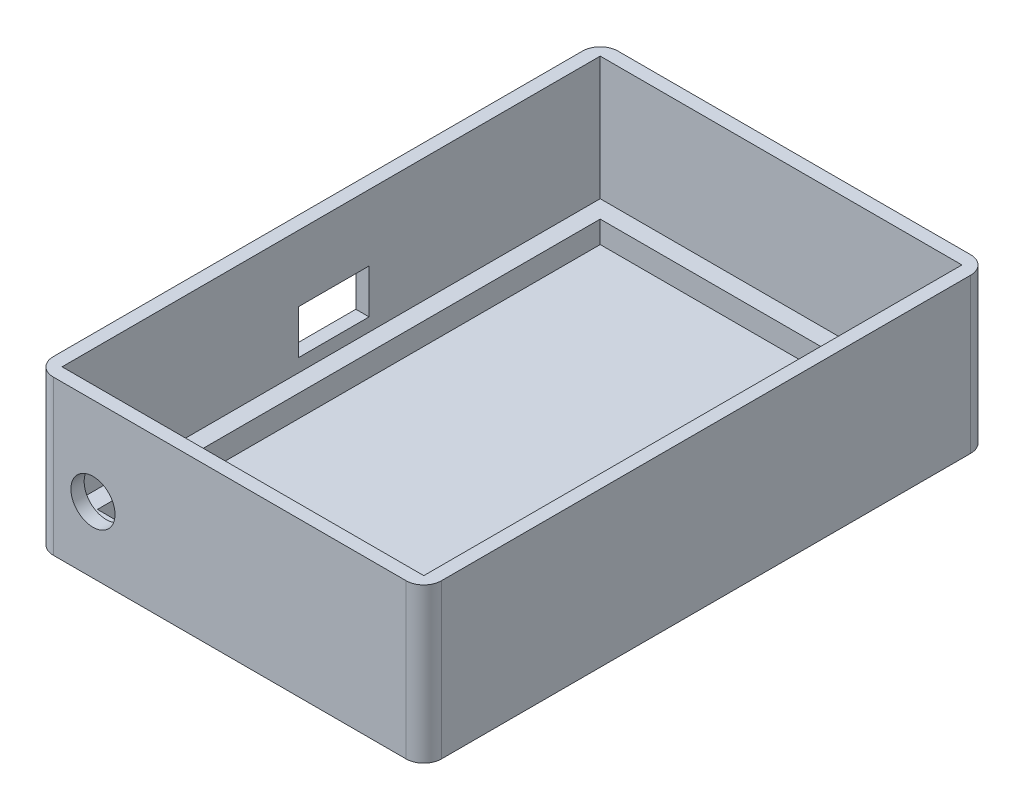
ISO-10303-21;
HEADER;
FILE_DESCRIPTION(('STEP AP214'),'2;1');
FILE_NAME('part.step','',(''),(''),'','','');
FILE_SCHEMA(('AUTOMOTIVE_DESIGN { 1 0 10303 214 1 1 1 1 }'));
ENDSEC;
DATA;
#1=APPLICATION_CONTEXT('core data for automotive mechanical design processes');
#2=APPLICATION_PROTOCOL_DEFINITION('international standard','automotive_design',2000,#1);
#3=PRODUCT_CONTEXT('',#1,'mechanical');
#4=PRODUCT('Part','Part','',(#3));
#5=PRODUCT_RELATED_PRODUCT_CATEGORY('part','',(#4));
#6=PRODUCT_DEFINITION_FORMATION('','',#4);
#7=PRODUCT_DEFINITION_CONTEXT('part definition',#1,'design');
#8=PRODUCT_DEFINITION('design','',#6,#7);
#9=PRODUCT_DEFINITION_SHAPE('','',#8);
#10=(LENGTH_UNIT() NAMED_UNIT(*) SI_UNIT(.MILLI.,.METRE.));
#11=(NAMED_UNIT(*) PLANE_ANGLE_UNIT() SI_UNIT($,.RADIAN.));
#12=(NAMED_UNIT(*) SI_UNIT($,.STERADIAN.) SOLID_ANGLE_UNIT());
#13=UNCERTAINTY_MEASURE_WITH_UNIT(LENGTH_MEASURE(1.E-05),#10,'distance_accuracy_value','');
#14=(GEOMETRIC_REPRESENTATION_CONTEXT(3) GLOBAL_UNCERTAINTY_ASSIGNED_CONTEXT((#13)) GLOBAL_UNIT_ASSIGNED_CONTEXT((#10,
#11,#12)) REPRESENTATION_CONTEXT('',''));
#15=CARTESIAN_POINT('',(0.,0.,0.));
#16=DIRECTION('',(0.,0.,1.));
#17=DIRECTION('',(1.,0.,0.));
#18=AXIS2_PLACEMENT_3D('',#15,#16,#17);
#19=CARTESIAN_POINT('',(-22.,-2.5,0.));
#20=DIRECTION('',(1.,0.,0.));
#21=DIRECTION('',(0.,0.,-1.));
#22=AXIS2_PLACEMENT_3D('',#19,#20,#21);
#23=PLANE('',#22);
#24=DIRECTION('',(0.,0.,-1.));
#25=VECTOR('',#24,1.);
#26=CARTESIAN_POINT('',(-22.,1.5,0.));
#27=LINE('',#26,#25);
#28=CARTESIAN_POINT('',(-22.,1.5,3.70191610471693));
#29=VERTEX_POINT('',#28);
#30=CARTESIAN_POINT('',(-22.,1.5,-4.29808389528307));
#31=VERTEX_POINT('',#30);
#32=EDGE_CURVE('E209',#29,#31,#27,.T.);
#33=ORIENTED_EDGE('',*,*,#32,.T.);
#34=DIRECTION('',(0.,1.,0.));
#35=VECTOR('',#34,1.);
#36=CARTESIAN_POINT('',(-22.,-2.5,-4.29808389528307));
#37=LINE('',#36,#35);
#38=CARTESIAN_POINT('',(-22.,6.5,-4.29808389528307));
#39=VERTEX_POINT('',#38);
#40=EDGE_CURVE('E212',#31,#39,#37,.T.);
#41=ORIENTED_EDGE('',*,*,#40,.T.);
#42=DIRECTION('',(0.,0.,1.));
#43=VECTOR('',#42,1.);
#44=CARTESIAN_POINT('',(-22.,6.5,0.));
#45=LINE('',#44,#43);
#46=CARTESIAN_POINT('',(-22.,6.5,3.70191610471693));
#47=VERTEX_POINT('',#46);
#48=EDGE_CURVE('E204',#39,#47,#45,.T.);
#49=ORIENTED_EDGE('',*,*,#48,.T.);
#50=DIRECTION('',(0.,-1.,0.));
#51=VECTOR('',#50,1.);
#52=CARTESIAN_POINT('',(-22.,-2.5,3.70191610471693));
#53=LINE('',#52,#51);
#54=EDGE_CURVE('E179',#47,#29,#53,.T.);
#55=ORIENTED_EDGE('',*,*,#54,.T.);
#56=EDGE_LOOP('',(#33,#41,#49,#55));
#57=FACE_BOUND('',#56,.T.);
#58=DIRECTION('',(0.,0.,-1.));
#59=VECTOR('',#58,1.);
#60=CARTESIAN_POINT('',(-22.,-3.5,32.));
#61=LINE('',#60,#59);
#62=CARTESIAN_POINT('',(-22.,-3.5,30.));
#63=VERTEX_POINT('',#62);
#64=CARTESIAN_POINT('',(-22.,-3.5,-30.));
#65=VERTEX_POINT('',#64);
#66=EDGE_CURVE('E218',#63,#65,#61,.T.);
#67=ORIENTED_EDGE('',*,*,#66,.F.);
#68=DIRECTION('',(0.,1.,0.));
#69=VECTOR('',#68,1.);
#70=CARTESIAN_POINT('',(-22.,14.,30.));
#71=LINE('',#70,#69);
#72=CARTESIAN_POINT('',(-22.,14.,30.));
#73=VERTEX_POINT('',#72);
#74=EDGE_CURVE('E299',#63,#73,#71,.T.);
#75=ORIENTED_EDGE('',*,*,#74,.T.);
#76=DIRECTION('',(0.,0.,1.));
#77=VECTOR('',#76,1.);
#78=CARTESIAN_POINT('',(-22.,14.,32.));
#79=LINE('',#78,#77);
#80=CARTESIAN_POINT('',(-22.,14.,-30.));
#81=VERTEX_POINT('',#80);
#82=EDGE_CURVE('E263',#81,#73,#79,.T.);
#83=ORIENTED_EDGE('',*,*,#82,.F.);
#84=DIRECTION('',(0.,1.,0.));
#85=VECTOR('',#84,1.);
#86=CARTESIAN_POINT('',(-22.,-2.5,-30.));
#87=LINE('',#86,#85);
#88=EDGE_CURVE('E292',#81,#65,#87,.F.);
#89=ORIENTED_EDGE('',*,*,#88,.T.);
#90=EDGE_LOOP('',(#67,#75,#83,#89));
#91=FACE_BOUND('',#90,.T.);
#92=ADVANCED_FACE('F33',(#57,#91),#23,.F.);
#93=CARTESIAN_POINT('',(0.,-2.5,-32.));
#94=DIRECTION('',(0.,0.,1.));
#95=DIRECTION('',(1.,0.,0.));
#96=AXIS2_PLACEMENT_3D('',#93,#94,#95);
#97=PLANE('',#96);
#98=DIRECTION('',(-1.,0.,0.));
#99=VECTOR('',#98,1.);
#100=CARTESIAN_POINT('',(-22.,14.,-32.));
#101=LINE('',#100,#99);
#102=CARTESIAN_POINT('',(20.,14.,-32.));
#103=VERTEX_POINT('',#102);
#104=CARTESIAN_POINT('',(-20.,14.,-32.));
#105=VERTEX_POINT('',#104);
#106=EDGE_CURVE('E260',#103,#105,#101,.T.);
#107=ORIENTED_EDGE('',*,*,#106,.F.);
#108=DIRECTION('',(0.,1.,0.));
#109=VECTOR('',#108,1.);
#110=CARTESIAN_POINT('',(20.,-3.5,-32.));
#111=LINE('',#110,#109);
#112=CARTESIAN_POINT('',(20.,-3.5,-32.));
#113=VERTEX_POINT('',#112);
#114=EDGE_CURVE('E11',#103,#113,#111,.F.);
#115=ORIENTED_EDGE('',*,*,#114,.T.);
#116=DIRECTION('',(1.,0.,0.));
#117=VECTOR('',#116,1.);
#118=CARTESIAN_POINT('',(-22.,-3.5,-32.));
#119=LINE('',#118,#117);
#120=CARTESIAN_POINT('',(-20.,-3.5,-32.));
#121=VERTEX_POINT('',#120);
#122=EDGE_CURVE('E221',#121,#113,#119,.T.);
#123=ORIENTED_EDGE('',*,*,#122,.F.);
#124=DIRECTION('',(0.,1.,0.));
#125=VECTOR('',#124,1.);
#126=CARTESIAN_POINT('',(-20.,-2.5,-32.));
#127=LINE('',#126,#125);
#128=EDGE_CURVE('E41',#121,#105,#127,.T.);
#129=ORIENTED_EDGE('',*,*,#128,.T.);
#130=EDGE_LOOP('',(#107,#115,#123,#129));
#131=FACE_BOUND('',#130,.T.);
#132=ADVANCED_FACE('F330',(#131),#97,.F.);
#133=CARTESIAN_POINT('',(22.,-2.5,0.));
#134=DIRECTION('',(1.,0.,0.));
#135=DIRECTION('',(0.,0.,-1.));
#136=AXIS2_PLACEMENT_3D('',#133,#134,#135);
#137=PLANE('',#136);
#138=DIRECTION('',(0.,0.,-1.));
#139=VECTOR('',#138,1.);
#140=CARTESIAN_POINT('',(22.,14.,32.));
#141=LINE('',#140,#139);
#142=CARTESIAN_POINT('',(22.,14.,30.));
#143=VERTEX_POINT('',#142);
#144=CARTESIAN_POINT('',(22.,14.,-30.));
#145=VERTEX_POINT('',#144);
#146=EDGE_CURVE('E257',#143,#145,#141,.T.);
#147=ORIENTED_EDGE('',*,*,#146,.F.);
#148=DIRECTION('',(0.,1.,0.));
#149=VECTOR('',#148,1.);
#150=CARTESIAN_POINT('',(22.,-2.5,30.));
#151=LINE('',#150,#149);
#152=CARTESIAN_POINT('',(22.,-3.5,30.));
#153=VERTEX_POINT('',#152);
#154=EDGE_CURVE('E48',#143,#153,#151,.F.);
#155=ORIENTED_EDGE('',*,*,#154,.T.);
#156=DIRECTION('',(0.,0.,1.));
#157=VECTOR('',#156,1.);
#158=CARTESIAN_POINT('',(22.,-3.5,-32.));
#159=LINE('',#158,#157);
#160=CARTESIAN_POINT('',(22.,-3.5,-30.));
#161=VERTEX_POINT('',#160);
#162=EDGE_CURVE('E223',#161,#153,#159,.T.);
#163=ORIENTED_EDGE('',*,*,#162,.F.);
#164=DIRECTION('',(0.,1.,0.));
#165=VECTOR('',#164,1.);
#166=CARTESIAN_POINT('',(22.,14.,-30.));
#167=LINE('',#166,#165);
#168=EDGE_CURVE('E322',#161,#145,#167,.T.);
#169=ORIENTED_EDGE('',*,*,#168,.T.);
#170=EDGE_LOOP('',(#147,#155,#163,#169));
#171=FACE_BOUND('',#170,.T.);
#172=ADVANCED_FACE('F341',(#171),#137,.T.);
#173=CARTESIAN_POINT('',(0.,-2.5,28.5));
#174=DIRECTION('',(0.,0.,1.));
#175=DIRECTION('',(1.,0.,0.));
#176=AXIS2_PLACEMENT_3D('',#173,#174,#175);
#177=PLANE('',#176);
#178=DIRECTION('',(1.,0.,0.));
#179=VECTOR('',#178,1.);
#180=CARTESIAN_POINT('',(0.,0.,28.5));
#181=LINE('',#180,#179);
#182=CARTESIAN_POINT('',(-18.5,0.,28.5));
#183=VERTEX_POINT('',#182);
#184=CARTESIAN_POINT('',(18.5,0.,28.5));
#185=VERTEX_POINT('',#184);
#186=EDGE_CURVE('E266',#183,#185,#181,.T.);
#187=ORIENTED_EDGE('',*,*,#186,.T.);
#188=DIRECTION('',(0.,1.,0.));
#189=VECTOR('',#188,1.);
#190=CARTESIAN_POINT('',(18.5,-2.5,28.5));
#191=LINE('',#190,#189);
#192=CARTESIAN_POINT('',(18.5,-2.5,28.5));
#193=VERTEX_POINT('',#192);
#194=EDGE_CURVE('E289',#193,#185,#191,.T.);
#195=ORIENTED_EDGE('',*,*,#194,.F.);
#196=DIRECTION('',(1.,0.,0.));
#197=VECTOR('',#196,1.);
#198=CARTESIAN_POINT('',(0.,-2.5,28.5));
#199=LINE('',#198,#197);
#200=CARTESIAN_POINT('',(-18.5,-2.5,28.5));
#201=VERTEX_POINT('',#200);
#202=EDGE_CURVE('E267',#201,#193,#199,.T.);
#203=ORIENTED_EDGE('',*,*,#202,.F.);
#204=DIRECTION('',(0.,1.,0.));
#205=VECTOR('',#204,1.);
#206=CARTESIAN_POINT('',(-18.5,-2.5,28.5));
#207=LINE('',#206,#205);
#208=EDGE_CURVE('E278',#201,#183,#207,.T.);
#209=ORIENTED_EDGE('',*,*,#208,.T.);
#210=EDGE_LOOP('',(#187,#195,#203,#209));
#211=FACE_BOUND('',#210,.T.);
#212=ADVANCED_FACE('F378',(#211),#177,.F.);
#213=CARTESIAN_POINT('',(18.5,-2.5,0.));
#214=DIRECTION('',(1.,0.,0.));
#215=DIRECTION('',(0.,0.,-1.));
#216=AXIS2_PLACEMENT_3D('',#213,#214,#215);
#217=PLANE('',#216);
#218=DIRECTION('',(0.,0.,-1.));
#219=VECTOR('',#218,1.);
#220=CARTESIAN_POINT('',(18.5,0.,0.));
#221=LINE('',#220,#219);
#222=CARTESIAN_POINT('',(18.5,0.,-28.5));
#223=VERTEX_POINT('',#222);
#224=EDGE_CURVE('E270',#185,#223,#221,.T.);
#225=ORIENTED_EDGE('',*,*,#224,.T.);
#226=DIRECTION('',(0.,1.,0.));
#227=VECTOR('',#226,1.);
#228=CARTESIAN_POINT('',(18.5,-2.5,-28.5));
#229=LINE('',#228,#227);
#230=CARTESIAN_POINT('',(18.5,-2.5,-28.5));
#231=VERTEX_POINT('',#230);
#232=EDGE_CURVE('E293',#231,#223,#229,.T.);
#233=ORIENTED_EDGE('',*,*,#232,.F.);
#234=DIRECTION('',(0.,0.,-1.));
#235=VECTOR('',#234,1.);
#236=CARTESIAN_POINT('',(18.5,-2.5,0.));
#237=LINE('',#236,#235);
#238=EDGE_CURVE('E276',#193,#231,#237,.T.);
#239=ORIENTED_EDGE('',*,*,#238,.F.);
#240=ORIENTED_EDGE('',*,*,#194,.T.);
#241=EDGE_LOOP('',(#225,#233,#239,#240));
#242=FACE_BOUND('',#241,.T.);
#243=ADVANCED_FACE('F374',(#242),#217,.F.);
#244=CARTESIAN_POINT('',(0.,-2.5,-28.5));
#245=DIRECTION('',(0.,0.,1.));
#246=DIRECTION('',(1.,0.,0.));
#247=AXIS2_PLACEMENT_3D('',#244,#245,#246);
#248=PLANE('',#247);
#249=DIRECTION('',(1.,0.,0.));
#250=VECTOR('',#249,1.);
#251=CARTESIAN_POINT('',(0.,0.,-28.5));
#252=LINE('',#251,#250);
#253=CARTESIAN_POINT('',(-18.5,0.,-28.5));
#254=VERTEX_POINT('',#253);
#255=EDGE_CURVE('E284',#254,#223,#252,.T.);
#256=ORIENTED_EDGE('',*,*,#255,.F.);
#257=DIRECTION('',(0.,1.,0.));
#258=VECTOR('',#257,1.);
#259=CARTESIAN_POINT('',(-18.5,-2.5,-28.5));
#260=LINE('',#259,#258);
#261=CARTESIAN_POINT('',(-18.5,-2.5,-28.5));
#262=VERTEX_POINT('',#261);
#263=EDGE_CURVE('E295',#262,#254,#260,.T.);
#264=ORIENTED_EDGE('',*,*,#263,.F.);
#265=DIRECTION('',(1.,0.,0.));
#266=VECTOR('',#265,1.);
#267=CARTESIAN_POINT('',(0.,-2.5,-28.5));
#268=LINE('',#267,#266);
#269=EDGE_CURVE('E273',#262,#231,#268,.T.);
#270=ORIENTED_EDGE('',*,*,#269,.T.);
#271=ORIENTED_EDGE('',*,*,#232,.T.);
#272=EDGE_LOOP('',(#256,#264,#270,#271));
#273=FACE_BOUND('',#272,.T.);
#274=ADVANCED_FACE('F377',(#273),#248,.T.);
#275=CARTESIAN_POINT('',(-18.5,-2.5,0.));
#276=DIRECTION('',(1.,0.,0.));
#277=DIRECTION('',(0.,0.,-1.));
#278=AXIS2_PLACEMENT_3D('',#275,#276,#277);
#279=PLANE('',#278);
#280=DIRECTION('',(0.,0.,-1.));
#281=VECTOR('',#280,1.);
#282=CARTESIAN_POINT('',(-18.5,0.,0.));
#283=LINE('',#282,#281);
#284=EDGE_CURVE('E281',#183,#254,#283,.T.);
#285=ORIENTED_EDGE('',*,*,#284,.F.);
#286=ORIENTED_EDGE('',*,*,#208,.F.);
#287=DIRECTION('',(0.,0.,-1.));
#288=VECTOR('',#287,1.);
#289=CARTESIAN_POINT('',(-18.5,-2.5,0.));
#290=LINE('',#289,#288);
#291=EDGE_CURVE('E269',#201,#262,#290,.T.);
#292=ORIENTED_EDGE('',*,*,#291,.T.);
#293=ORIENTED_EDGE('',*,*,#263,.T.);
#294=EDGE_LOOP('',(#285,#286,#292,#293));
#295=FACE_BOUND('',#294,.T.);
#296=ADVANCED_FACE('F382',(#295),#279,.T.);
#297=CARTESIAN_POINT('',(0.,-2.5,32.));
#298=DIRECTION('',(0.,0.,1.));
#299=DIRECTION('',(1.,0.,0.));
#300=AXIS2_PLACEMENT_3D('',#297,#298,#299);
#301=PLANE('',#300);
#302=CARTESIAN_POINT('',(-15.5,4.,32.));
#303=DIRECTION('',(0.,0.,1.));
#304=DIRECTION('',(1.,0.,0.));
#305=AXIS2_PLACEMENT_3D('',#302,#303,#304);
#306=CIRCLE('',#305,2.5);
#307=CARTESIAN_POINT('',(-13.,4.,32.));
#308=VERTEX_POINT('',#307);
#309=EDGE_CURVE('E630',#308,#308,#306,.T.);
#310=ORIENTED_EDGE('',*,*,#309,.F.);
#311=EDGE_LOOP('',(#310));
#312=FACE_BOUND('',#311,.T.);
#313=DIRECTION('',(1.,0.,0.));
#314=VECTOR('',#313,1.);
#315=CARTESIAN_POINT('',(-22.,14.,32.));
#316=LINE('',#315,#314);
#317=CARTESIAN_POINT('',(-20.,14.,32.));
#318=VERTEX_POINT('',#317);
#319=CARTESIAN_POINT('',(20.,14.,32.));
#320=VERTEX_POINT('',#319);
#321=EDGE_CURVE('E254',#318,#320,#316,.T.);
#322=ORIENTED_EDGE('',*,*,#321,.F.);
#323=DIRECTION('',(0.,1.,0.));
#324=VECTOR('',#323,1.);
#325=CARTESIAN_POINT('',(-20.,-3.5,32.));
#326=LINE('',#325,#324);
#327=CARTESIAN_POINT('',(-20.,-3.5,32.));
#328=VERTEX_POINT('',#327);
#329=EDGE_CURVE('E313',#318,#328,#326,.F.);
#330=ORIENTED_EDGE('',*,*,#329,.T.);
#331=DIRECTION('',(-1.,0.,0.));
#332=VECTOR('',#331,1.);
#333=CARTESIAN_POINT('',(22.,-3.5,32.));
#334=LINE('',#333,#332);
#335=CARTESIAN_POINT('',(20.,-3.5,32.));
#336=VERTEX_POINT('',#335);
#337=EDGE_CURVE('E215',#336,#328,#334,.T.);
#338=ORIENTED_EDGE('',*,*,#337,.F.);
#339=DIRECTION('',(0.,1.,0.));
#340=VECTOR('',#339,1.);
#341=CARTESIAN_POINT('',(20.,-2.5,32.));
#342=LINE('',#341,#340);
#343=EDGE_CURVE('E310',#336,#320,#342,.T.);
#344=ORIENTED_EDGE('',*,*,#343,.T.);
#345=EDGE_LOOP('',(#322,#330,#338,#344));
#346=FACE_BOUND('',#345,.T.);
#347=ADVANCED_FACE('F350',(#312,#346),#301,.T.);
#348=CARTESIAN_POINT('',(0.,0.,0.));
#349=DIRECTION('',(0.,1.,0.));
#350=DIRECTION('',(0.,0.,1.));
#351=AXIS2_PLACEMENT_3D('',#348,#349,#350);
#352=PLANE('',#351);
#353=DIRECTION('',(0.,0.,1.));
#354=VECTOR('',#353,1.);
#355=CARTESIAN_POINT('',(-20.5,0.,-30.5));
#356=LINE('',#355,#354);
#357=CARTESIAN_POINT('',(-20.5,0.,-30.5));
#358=VERTEX_POINT('',#357);
#359=CARTESIAN_POINT('',(-20.5,0.,30.5));
#360=VERTEX_POINT('',#359);
#361=EDGE_CURVE('E225',#358,#360,#356,.T.);
#362=ORIENTED_EDGE('',*,*,#361,.T.);
#363=DIRECTION('',(1.,0.,0.));
#364=VECTOR('',#363,1.);
#365=CARTESIAN_POINT('',(20.5,0.,30.5));
#366=LINE('',#365,#364);
#367=CARTESIAN_POINT('',(20.5,0.,30.5));
#368=VERTEX_POINT('',#367);
#369=EDGE_CURVE('E238',#360,#368,#366,.T.);
#370=ORIENTED_EDGE('',*,*,#369,.T.);
#371=DIRECTION('',(0.,0.,-1.));
#372=VECTOR('',#371,1.);
#373=CARTESIAN_POINT('',(20.5,0.,-30.5));
#374=LINE('',#373,#372);
#375=CARTESIAN_POINT('',(20.5,0.,-30.5));
#376=VERTEX_POINT('',#375);
#377=EDGE_CURVE('E240',#368,#376,#374,.T.);
#378=ORIENTED_EDGE('',*,*,#377,.T.);
#379=DIRECTION('',(-1.,0.,0.));
#380=VECTOR('',#379,1.);
#381=CARTESIAN_POINT('',(20.5,0.,-30.5));
#382=LINE('',#381,#380);
#383=EDGE_CURVE('E229',#376,#358,#382,.T.);
#384=ORIENTED_EDGE('',*,*,#383,.T.);
#385=EDGE_LOOP('',(#362,#370,#378,#384));
#386=FACE_BOUND('',#385,.T.);
#387=ORIENTED_EDGE('',*,*,#186,.F.);
#388=ORIENTED_EDGE('',*,*,#284,.T.);
#389=ORIENTED_EDGE('',*,*,#255,.T.);
#390=ORIENTED_EDGE('',*,*,#224,.F.);
#391=EDGE_LOOP('',(#387,#388,#389,#390));
#392=FACE_BOUND('',#391,.T.);
#393=ADVANCED_FACE('F483',(#386,#392),#352,.T.);
#394=CARTESIAN_POINT('',(0.,14.,0.));
#395=DIRECTION('',(0.,1.,0.));
#396=DIRECTION('',(0.,0.,1.));
#397=AXIS2_PLACEMENT_3D('',#394,#395,#396);
#398=PLANE('',#397);
#399=ORIENTED_EDGE('',*,*,#82,.T.);
#400=CARTESIAN_POINT('',(-20.,14.,30.));
#401=DIRECTION('',(0.,1.,0.));
#402=DIRECTION('',(0.,0.,1.));
#403=AXIS2_PLACEMENT_3D('',#400,#401,#402);
#404=CIRCLE('',#403,2.);
#405=EDGE_CURVE('E308',#73,#318,#404,.T.);
#406=ORIENTED_EDGE('',*,*,#405,.T.);
#407=ORIENTED_EDGE('',*,*,#321,.T.);
#408=CARTESIAN_POINT('',(20.,14.,30.));
#409=DIRECTION('',(0.,1.,0.));
#410=DIRECTION('',(0.,0.,1.));
#411=AXIS2_PLACEMENT_3D('',#408,#409,#410);
#412=CIRCLE('',#411,2.);
#413=EDGE_CURVE('E306',#320,#143,#412,.T.);
#414=ORIENTED_EDGE('',*,*,#413,.T.);
#415=ORIENTED_EDGE('',*,*,#146,.T.);
#416=CARTESIAN_POINT('',(20.,14.,-30.));
#417=DIRECTION('',(0.,1.,0.));
#418=DIRECTION('',(0.,0.,1.));
#419=AXIS2_PLACEMENT_3D('',#416,#417,#418);
#420=CIRCLE('',#419,2.);
#421=EDGE_CURVE('E304',#145,#103,#420,.T.);
#422=ORIENTED_EDGE('',*,*,#421,.T.);
#423=ORIENTED_EDGE('',*,*,#106,.T.);
#424=CARTESIAN_POINT('',(-20.,14.,-30.));
#425=DIRECTION('',(0.,1.,0.));
#426=DIRECTION('',(0.,0.,1.));
#427=AXIS2_PLACEMENT_3D('',#424,#425,#426);
#428=CIRCLE('',#427,2.);
#429=EDGE_CURVE('E302',#105,#81,#428,.T.);
#430=ORIENTED_EDGE('',*,*,#429,.T.);
#431=EDGE_LOOP('',(#399,#406,#407,#414,#415,#422,#423,#430));
#432=FACE_BOUND('',#431,.T.);
#433=DIRECTION('',(1.,0.,0.));
#434=VECTOR('',#433,1.);
#435=CARTESIAN_POINT('',(20.5,14.,30.5));
#436=LINE('',#435,#434);
#437=CARTESIAN_POINT('',(-20.5,14.,30.5));
#438=VERTEX_POINT('',#437);
#439=CARTESIAN_POINT('',(20.5,14.,30.5));
#440=VERTEX_POINT('',#439);
#441=EDGE_CURVE('E228',#438,#440,#436,.T.);
#442=ORIENTED_EDGE('',*,*,#441,.F.);
#443=DIRECTION('',(0.,0.,1.));
#444=VECTOR('',#443,1.);
#445=CARTESIAN_POINT('',(-20.5,14.,-30.5));
#446=LINE('',#445,#444);
#447=CARTESIAN_POINT('',(-20.5,14.,-30.5));
#448=VERTEX_POINT('',#447);
#449=EDGE_CURVE('E226',#448,#438,#446,.T.);
#450=ORIENTED_EDGE('',*,*,#449,.F.);
#451=DIRECTION('',(-1.,0.,0.));
#452=VECTOR('',#451,1.);
#453=CARTESIAN_POINT('',(20.5,14.,-30.5));
#454=LINE('',#453,#452);
#455=CARTESIAN_POINT('',(20.5,14.,-30.5));
#456=VERTEX_POINT('',#455);
#457=EDGE_CURVE('E234',#456,#448,#454,.T.);
#458=ORIENTED_EDGE('',*,*,#457,.F.);
#459=DIRECTION('',(0.,0.,-1.));
#460=VECTOR('',#459,1.);
#461=CARTESIAN_POINT('',(20.5,14.,-30.5));
#462=LINE('',#461,#460);
#463=EDGE_CURVE('E231',#440,#456,#462,.T.);
#464=ORIENTED_EDGE('',*,*,#463,.F.);
#465=EDGE_LOOP('',(#442,#450,#458,#464));
#466=FACE_BOUND('',#465,.T.);
#467=ADVANCED_FACE('F335',(#432,#466),#398,.T.);
#468=CARTESIAN_POINT('',(-20.5,14.,-30.5));
#469=DIRECTION('',(1.,0.,0.));
#470=DIRECTION('',(0.,0.,-1.));
#471=AXIS2_PLACEMENT_3D('',#468,#469,#470);
#472=PLANE('',#471);
#473=DIRECTION('',(0.,1.,0.));
#474=VECTOR('',#473,1.);
#475=CARTESIAN_POINT('',(-20.5,1.5,-4.29808389528307));
#476=LINE('',#475,#474);
#477=CARTESIAN_POINT('',(-20.5,1.5,-4.29808389528307));
#478=VERTEX_POINT('',#477);
#479=CARTESIAN_POINT('',(-20.5,6.5,-4.29808389528307));
#480=VERTEX_POINT('',#479);
#481=EDGE_CURVE('E192',#478,#480,#476,.T.);
#482=ORIENTED_EDGE('',*,*,#481,.F.);
#483=DIRECTION('',(0.,0.,-1.));
#484=VECTOR('',#483,1.);
#485=CARTESIAN_POINT('',(-20.5,1.5,3.70191610471693));
#486=LINE('',#485,#484);
#487=CARTESIAN_POINT('',(-20.5,1.5,3.70191610471693));
#488=VERTEX_POINT('',#487);
#489=EDGE_CURVE('E197',#488,#478,#486,.T.);
#490=ORIENTED_EDGE('',*,*,#489,.F.);
#491=DIRECTION('',(0.,-1.,0.));
#492=VECTOR('',#491,1.);
#493=CARTESIAN_POINT('',(-20.5,1.5,3.70191610471693));
#494=LINE('',#493,#492);
#495=CARTESIAN_POINT('',(-20.5,6.5,3.70191610471693));
#496=VERTEX_POINT('',#495);
#497=EDGE_CURVE('E176',#496,#488,#494,.T.);
#498=ORIENTED_EDGE('',*,*,#497,.F.);
#499=DIRECTION('',(0.,0.,1.));
#500=VECTOR('',#499,1.);
#501=CARTESIAN_POINT('',(-20.5,6.5,3.70191610471693));
#502=LINE('',#501,#500);
#503=EDGE_CURVE('E187',#480,#496,#502,.T.);
#504=ORIENTED_EDGE('',*,*,#503,.F.);
#505=EDGE_LOOP('',(#482,#490,#498,#504));
#506=FACE_BOUND('',#505,.T.);
#507=ORIENTED_EDGE('',*,*,#361,.F.);
#508=DIRECTION('',(0.,-1.,0.));
#509=VECTOR('',#508,1.);
#510=CARTESIAN_POINT('',(-20.5,14.,-30.5));
#511=LINE('',#510,#509);
#512=EDGE_CURVE('E236',#448,#358,#511,.T.);
#513=ORIENTED_EDGE('',*,*,#512,.F.);
#514=ORIENTED_EDGE('',*,*,#449,.T.);
#515=DIRECTION('',(0.,-1.,0.));
#516=VECTOR('',#515,1.);
#517=CARTESIAN_POINT('',(-20.5,14.,30.5));
#518=LINE('',#517,#516);
#519=EDGE_CURVE('E251',#438,#360,#518,.T.);
#520=ORIENTED_EDGE('',*,*,#519,.T.);
#521=EDGE_LOOP('',(#507,#513,#514,#520));
#522=FACE_BOUND('',#521,.T.);
#523=ADVANCED_FACE('F194',(#506,#522),#472,.T.);
#524=CARTESIAN_POINT('',(20.5,14.,30.5));
#525=DIRECTION('',(0.,0.,-1.));
#526=DIRECTION('',(-1.,0.,0.));
#527=AXIS2_PLACEMENT_3D('',#524,#525,#526);
#528=PLANE('',#527);
#529=CARTESIAN_POINT('',(-15.5,4.,30.5));
#530=DIRECTION('',(0.,0.,-1.));
#531=DIRECTION('',(-1.,0.,0.));
#532=AXIS2_PLACEMENT_3D('',#529,#530,#531);
#533=CIRCLE('',#532,2.5);
#534=CARTESIAN_POINT('',(-18.,4.,30.5));
#535=VERTEX_POINT('',#534);
#536=EDGE_CURVE('E628',#535,#535,#533,.T.);
#537=ORIENTED_EDGE('',*,*,#536,.F.);
#538=EDGE_LOOP('',(#537));
#539=FACE_BOUND('',#538,.T.);
#540=ORIENTED_EDGE('',*,*,#369,.F.);
#541=ORIENTED_EDGE('',*,*,#519,.F.);
#542=ORIENTED_EDGE('',*,*,#441,.T.);
#543=DIRECTION('',(0.,-1.,0.));
#544=VECTOR('',#543,1.);
#545=CARTESIAN_POINT('',(20.5,14.,30.5));
#546=LINE('',#545,#544);
#547=EDGE_CURVE('E248',#440,#368,#546,.T.);
#548=ORIENTED_EDGE('',*,*,#547,.T.);
#549=EDGE_LOOP('',(#540,#541,#542,#548));
#550=FACE_BOUND('',#549,.T.);
#551=ADVANCED_FACE('F533',(#539,#550),#528,.T.);
#552=CARTESIAN_POINT('',(20.5,14.,-30.5));
#553=DIRECTION('',(-1.,0.,0.));
#554=DIRECTION('',(0.,0.,1.));
#555=AXIS2_PLACEMENT_3D('',#552,#553,#554);
#556=PLANE('',#555);
#557=ORIENTED_EDGE('',*,*,#377,.F.);
#558=ORIENTED_EDGE('',*,*,#547,.F.);
#559=ORIENTED_EDGE('',*,*,#463,.T.);
#560=DIRECTION('',(0.,-1.,0.));
#561=VECTOR('',#560,1.);
#562=CARTESIAN_POINT('',(20.5,14.,-30.5));
#563=LINE('',#562,#561);
#564=EDGE_CURVE('E245',#456,#376,#563,.T.);
#565=ORIENTED_EDGE('',*,*,#564,.T.);
#566=EDGE_LOOP('',(#557,#558,#559,#565));
#567=FACE_BOUND('',#566,.T.);
#568=ADVANCED_FACE('F523',(#567),#556,.T.);
#569=CARTESIAN_POINT('',(20.5,14.,-30.5));
#570=DIRECTION('',(0.,0.,1.));
#571=DIRECTION('',(1.,0.,0.));
#572=AXIS2_PLACEMENT_3D('',#569,#570,#571);
#573=PLANE('',#572);
#574=ORIENTED_EDGE('',*,*,#383,.F.);
#575=ORIENTED_EDGE('',*,*,#564,.F.);
#576=ORIENTED_EDGE('',*,*,#457,.T.);
#577=ORIENTED_EDGE('',*,*,#512,.T.);
#578=EDGE_LOOP('',(#574,#575,#576,#577));
#579=FACE_BOUND('',#578,.T.);
#580=ADVANCED_FACE('F473',(#579),#573,.T.);
#581=CARTESIAN_POINT('',(0.,-3.5,0.));
#582=DIRECTION('',(0.,-1.,0.));
#583=DIRECTION('',(0.,0.,-1.));
#584=AXIS2_PLACEMENT_3D('',#581,#582,#583);
#585=PLANE('',#584);
#586=ORIENTED_EDGE('',*,*,#337,.T.);
#587=CARTESIAN_POINT('',(-20.,-3.5,30.));
#588=DIRECTION('',(0.,-1.,0.));
#589=DIRECTION('',(0.,0.,-1.));
#590=AXIS2_PLACEMENT_3D('',#587,#588,#589);
#591=CIRCLE('',#590,2.);
#592=EDGE_CURVE('E320',#328,#63,#591,.T.);
#593=ORIENTED_EDGE('',*,*,#592,.T.);
#594=ORIENTED_EDGE('',*,*,#66,.T.);
#595=CARTESIAN_POINT('',(-20.,-3.5,-30.));
#596=DIRECTION('',(0.,-1.,0.));
#597=DIRECTION('',(0.,0.,-1.));
#598=AXIS2_PLACEMENT_3D('',#595,#596,#597);
#599=CIRCLE('',#598,2.);
#600=EDGE_CURVE('E315',#65,#121,#599,.T.);
#601=ORIENTED_EDGE('',*,*,#600,.T.);
#602=ORIENTED_EDGE('',*,*,#122,.T.);
#603=CARTESIAN_POINT('',(20.,-3.5,-30.));
#604=DIRECTION('',(0.,-1.,0.));
#605=DIRECTION('',(0.,0.,-1.));
#606=AXIS2_PLACEMENT_3D('',#603,#604,#605);
#607=CIRCLE('',#606,2.);
#608=EDGE_CURVE('E55',#113,#161,#607,.T.);
#609=ORIENTED_EDGE('',*,*,#608,.T.);
#610=ORIENTED_EDGE('',*,*,#162,.T.);
#611=CARTESIAN_POINT('',(20.,-3.5,30.));
#612=DIRECTION('',(0.,-1.,0.));
#613=DIRECTION('',(0.,0.,-1.));
#614=AXIS2_PLACEMENT_3D('',#611,#612,#613);
#615=CIRCLE('',#614,2.);
#616=EDGE_CURVE('E318',#153,#336,#615,.T.);
#617=ORIENTED_EDGE('',*,*,#616,.T.);
#618=EDGE_LOOP('',(#586,#593,#594,#601,#602,#609,#610,#617));
#619=FACE_BOUND('',#618,.T.);
#620=ADVANCED_FACE('F343',(#619),#585,.T.);
#621=CARTESIAN_POINT('',(0.,-2.5,0.));
#622=DIRECTION('',(0.,-1.,0.));
#623=DIRECTION('',(0.,0.,-1.));
#624=AXIS2_PLACEMENT_3D('',#621,#622,#623);
#625=PLANE('',#624);
#626=ORIENTED_EDGE('',*,*,#291,.F.);
#627=ORIENTED_EDGE('',*,*,#202,.T.);
#628=ORIENTED_EDGE('',*,*,#238,.T.);
#629=ORIENTED_EDGE('',*,*,#269,.F.);
#630=EDGE_LOOP('',(#626,#627,#628,#629));
#631=FACE_BOUND('',#630,.T.);
#632=ADVANCED_FACE('F455',(#631),#625,.F.);
#633=CARTESIAN_POINT('',(-28.5,1.5,-4.29808389528307));
#634=DIRECTION('',(0.,0.,-1.));
#635=DIRECTION('',(-1.,0.,0.));
#636=AXIS2_PLACEMENT_3D('',#633,#634,#635);
#637=PLANE('',#636);
#638=DIRECTION('',(1.,0.,0.));
#639=VECTOR('',#638,1.);
#640=CARTESIAN_POINT('',(-28.5,1.5,-4.29808389528307));
#641=LINE('',#640,#639);
#642=EDGE_CURVE('E202',#31,#478,#641,.T.);
#643=ORIENTED_EDGE('',*,*,#642,.T.);
#644=ORIENTED_EDGE('',*,*,#481,.T.);
#645=DIRECTION('',(1.,0.,0.));
#646=VECTOR('',#645,1.);
#647=CARTESIAN_POINT('',(-28.5,6.5,-4.29808389528307));
#648=LINE('',#647,#646);
#649=EDGE_CURVE('E183',#39,#480,#648,.T.);
#650=ORIENTED_EDGE('',*,*,#649,.F.);
#651=ORIENTED_EDGE('',*,*,#40,.F.);
#652=EDGE_LOOP('',(#643,#644,#650,#651));
#653=FACE_BOUND('',#652,.T.);
#654=ADVANCED_FACE('F446',(#653),#637,.F.);
#655=CARTESIAN_POINT('',(-28.5,1.5,3.70191610471693));
#656=DIRECTION('',(0.,-1.,0.));
#657=DIRECTION('',(0.,0.,-1.));
#658=AXIS2_PLACEMENT_3D('',#655,#656,#657);
#659=PLANE('',#658);
#660=DIRECTION('',(1.,0.,0.));
#661=VECTOR('',#660,1.);
#662=CARTESIAN_POINT('',(-28.5,1.5,3.70191610471693));
#663=LINE('',#662,#661);
#664=EDGE_CURVE('E182',#29,#488,#663,.T.);
#665=ORIENTED_EDGE('',*,*,#664,.T.);
#666=ORIENTED_EDGE('',*,*,#489,.T.);
#667=ORIENTED_EDGE('',*,*,#642,.F.);
#668=ORIENTED_EDGE('',*,*,#32,.F.);
#669=EDGE_LOOP('',(#665,#666,#667,#668));
#670=FACE_BOUND('',#669,.T.);
#671=ADVANCED_FACE('F438',(#670),#659,.F.);
#672=CARTESIAN_POINT('',(-28.5,1.5,3.70191610471693));
#673=DIRECTION('',(0.,0.,1.));
#674=DIRECTION('',(1.,0.,0.));
#675=AXIS2_PLACEMENT_3D('',#672,#673,#674);
#676=PLANE('',#675);
#677=DIRECTION('',(1.,0.,0.));
#678=VECTOR('',#677,1.);
#679=CARTESIAN_POINT('',(-28.5,6.5,3.70191610471693));
#680=LINE('',#679,#678);
#681=EDGE_CURVE('E171',#47,#496,#680,.T.);
#682=ORIENTED_EDGE('',*,*,#681,.T.);
#683=ORIENTED_EDGE('',*,*,#497,.T.);
#684=ORIENTED_EDGE('',*,*,#664,.F.);
#685=ORIENTED_EDGE('',*,*,#54,.F.);
#686=EDGE_LOOP('',(#682,#683,#684,#685));
#687=FACE_BOUND('',#686,.T.);
#688=ADVANCED_FACE('F173',(#687),#676,.F.);
#689=CARTESIAN_POINT('',(-28.5,6.5,3.70191610471693));
#690=DIRECTION('',(0.,1.,0.));
#691=DIRECTION('',(0.,0.,1.));
#692=AXIS2_PLACEMENT_3D('',#689,#690,#691);
#693=PLANE('',#692);
#694=ORIENTED_EDGE('',*,*,#649,.T.);
#695=ORIENTED_EDGE('',*,*,#503,.T.);
#696=ORIENTED_EDGE('',*,*,#681,.F.);
#697=ORIENTED_EDGE('',*,*,#48,.F.);
#698=EDGE_LOOP('',(#694,#695,#696,#697));
#699=FACE_BOUND('',#698,.T.);
#700=ADVANCED_FACE('F188',(#699),#693,.F.);
#701=CARTESIAN_POINT('',(-15.5,4.,38.5));
#702=DIRECTION('',(0.,0.,-1.));
#703=DIRECTION('',(-1.,0.,0.));
#704=AXIS2_PLACEMENT_3D('',#701,#702,#703);
#705=CYLINDRICAL_SURFACE('',#704,2.5);
#706=ORIENTED_EDGE('',*,*,#309,.T.);
#707=EDGE_LOOP('',(#706));
#708=FACE_BOUND('',#707,.T.);
#709=ORIENTED_EDGE('',*,*,#536,.T.);
#710=EDGE_LOOP('',(#709));
#711=FACE_BOUND('',#710,.T.);
#712=ADVANCED_FACE('F392',(#708,#711),#705,.F.);
#713=CARTESIAN_POINT('',(-20.,-2.5,30.));
#714=DIRECTION('',(0.,-1.,0.));
#715=DIRECTION('',(0.,0.,-1.));
#716=AXIS2_PLACEMENT_3D('',#713,#714,#715);
#717=CYLINDRICAL_SURFACE('',#716,2.);
#718=ORIENTED_EDGE('',*,*,#592,.F.);
#719=ORIENTED_EDGE('',*,*,#329,.F.);
#720=ORIENTED_EDGE('',*,*,#405,.F.);
#721=ORIENTED_EDGE('',*,*,#74,.F.);
#722=EDGE_LOOP('',(#718,#719,#720,#721));
#723=FACE_BOUND('',#722,.T.);
#724=ADVANCED_FACE('F355',(#723),#717,.T.);
#725=CARTESIAN_POINT('',(20.,-2.5,30.));
#726=DIRECTION('',(0.,1.,0.));
#727=DIRECTION('',(0.,0.,1.));
#728=AXIS2_PLACEMENT_3D('',#725,#726,#727);
#729=CYLINDRICAL_SURFACE('',#728,2.);
#730=ORIENTED_EDGE('',*,*,#616,.F.);
#731=ORIENTED_EDGE('',*,*,#154,.F.);
#732=ORIENTED_EDGE('',*,*,#413,.F.);
#733=ORIENTED_EDGE('',*,*,#343,.F.);
#734=EDGE_LOOP('',(#730,#731,#732,#733));
#735=FACE_BOUND('',#734,.T.);
#736=ADVANCED_FACE('F347',(#735),#729,.T.);
#737=CARTESIAN_POINT('',(20.,-2.5,-30.));
#738=DIRECTION('',(0.,-1.,0.));
#739=DIRECTION('',(0.,0.,-1.));
#740=AXIS2_PLACEMENT_3D('',#737,#738,#739);
#741=CYLINDRICAL_SURFACE('',#740,2.);
#742=ORIENTED_EDGE('',*,*,#608,.F.);
#743=ORIENTED_EDGE('',*,*,#114,.F.);
#744=ORIENTED_EDGE('',*,*,#421,.F.);
#745=ORIENTED_EDGE('',*,*,#168,.F.);
#746=EDGE_LOOP('',(#742,#743,#744,#745));
#747=FACE_BOUND('',#746,.T.);
#748=ADVANCED_FACE('F340',(#747),#741,.T.);
#749=CARTESIAN_POINT('',(-20.,-2.5,-30.));
#750=DIRECTION('',(0.,1.,0.));
#751=DIRECTION('',(0.,0.,1.));
#752=AXIS2_PLACEMENT_3D('',#749,#750,#751);
#753=CYLINDRICAL_SURFACE('',#752,2.);
#754=ORIENTED_EDGE('',*,*,#600,.F.);
#755=ORIENTED_EDGE('',*,*,#88,.F.);
#756=ORIENTED_EDGE('',*,*,#429,.F.);
#757=ORIENTED_EDGE('',*,*,#128,.F.);
#758=EDGE_LOOP('',(#754,#755,#756,#757));
#759=FACE_BOUND('',#758,.T.);
#760=ADVANCED_FACE('F35',(#759),#753,.T.);
#761=CLOSED_SHELL('',(#92,#132,#172,#212,#243,#274,#296,#347,#393,#467,#523,#551,#568,#580,#620,
#632,#654,#671,#688,#700,#712,#724,#736,#748,#760));
#762=MANIFOLD_SOLID_BREP('B2',#761);
#763=ADVANCED_BREP_SHAPE_REPRESENTATION('',(#18,#762),#14);
#764=SHAPE_DEFINITION_REPRESENTATION(#9,#763);
ENDSEC;
END-ISO-10303-21;
